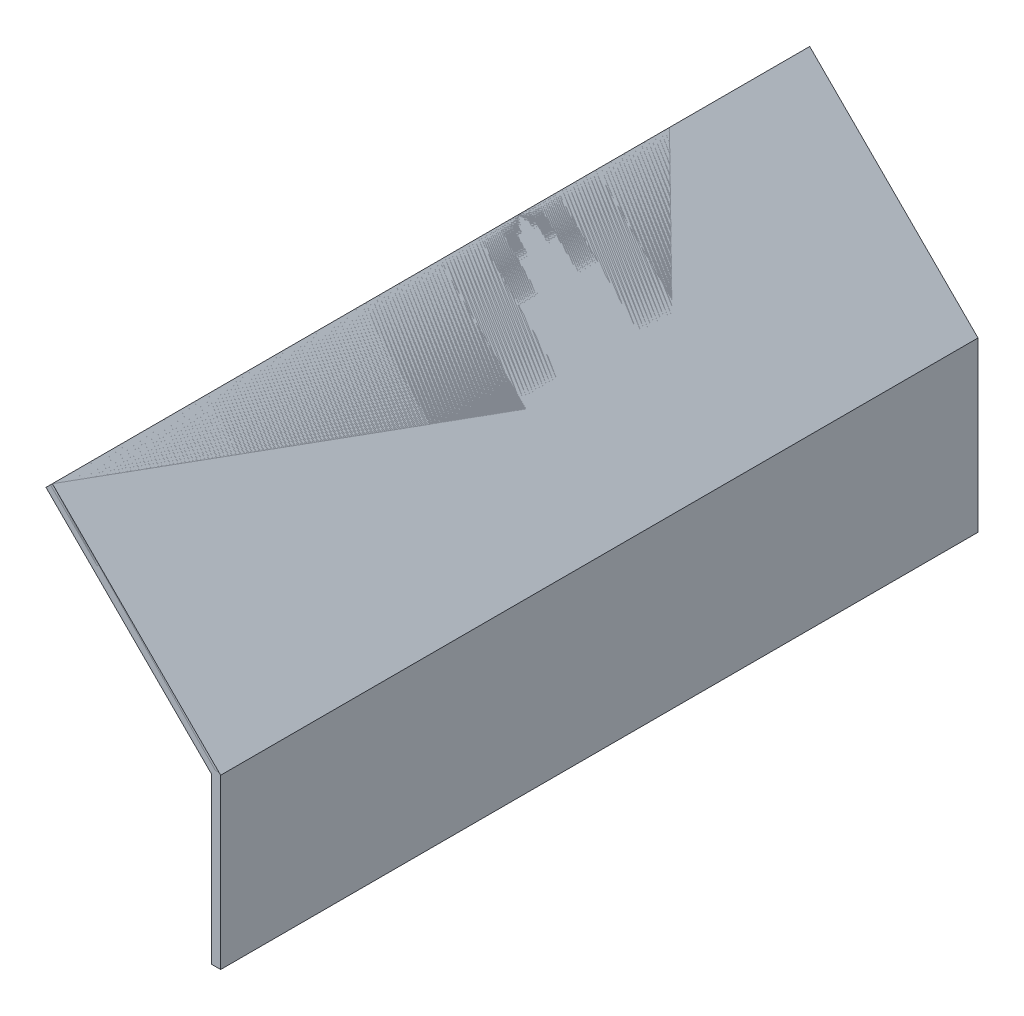
ISO-10303-21;
HEADER;
FILE_DESCRIPTION(('STEP AP214'),'2;1');
FILE_NAME('part.step','',(''),(''),'','','');
FILE_SCHEMA(('AUTOMOTIVE_DESIGN { 1 0 10303 214 1 1 1 1 }'));
ENDSEC;
DATA;
#1=APPLICATION_CONTEXT('core data for automotive mechanical design processes');
#2=APPLICATION_PROTOCOL_DEFINITION('international standard','automotive_design',2000,#1);
#3=PRODUCT_CONTEXT('',#1,'mechanical');
#4=PRODUCT('Part','Part','',(#3));
#5=PRODUCT_RELATED_PRODUCT_CATEGORY('part','',(#4));
#6=PRODUCT_DEFINITION_FORMATION('','',#4);
#7=PRODUCT_DEFINITION_CONTEXT('part definition',#1,'design');
#8=PRODUCT_DEFINITION('design','',#6,#7);
#9=PRODUCT_DEFINITION_SHAPE('','',#8);
#10=(LENGTH_UNIT() NAMED_UNIT(*) SI_UNIT(.MILLI.,.METRE.));
#11=(NAMED_UNIT(*) PLANE_ANGLE_UNIT() SI_UNIT($,.RADIAN.));
#12=(NAMED_UNIT(*) SI_UNIT($,.STERADIAN.) SOLID_ANGLE_UNIT());
#13=UNCERTAINTY_MEASURE_WITH_UNIT(LENGTH_MEASURE(1.E-05),#10,'distance_accuracy_value','');
#14=(GEOMETRIC_REPRESENTATION_CONTEXT(3) GLOBAL_UNCERTAINTY_ASSIGNED_CONTEXT((#13)) GLOBAL_UNIT_ASSIGNED_CONTEXT((#10,
#11,#12)) REPRESENTATION_CONTEXT('',''));
#15=CARTESIAN_POINT('',(0.,0.,0.));
#16=DIRECTION('',(0.,0.,1.));
#17=DIRECTION('',(1.,0.,0.));
#18=AXIS2_PLACEMENT_3D('',#15,#16,#17);
#19=CARTESIAN_POINT('',(4.064,76.2,0.));
#20=DIRECTION('',(0.,0.,-1.));
#21=DIRECTION('',(-0.707106781186549,0.707106781186546,0.));
#22=AXIS2_PLACEMENT_3D('',#19,#20,#21);
#23=PLANE('',#22);
#24=DIRECTION('',(-0.707106781186549,0.707106781186546,0.));
#25=VECTOR('',#24,1.);
#26=CARTESIAN_POINT('',(3.20548751482579,75.3414875148258,0.));
#27=LINE('',#26,#25);
#28=CARTESIAN_POINT('',(1.61939312693271,76.9275819027189,0.));
#29=VERTEX_POINT('',#28);
#30=CARTESIAN_POINT('',(-72.9945124851745,151.541487514826,0.));
#31=VERTEX_POINT('',#30);
#32=EDGE_CURVE('E201',#29,#31,#27,.T.);
#33=ORIENTED_EDGE('',*,*,#32,.F.);
#34=DIRECTION('',(1.,0.,0.));
#35=VECTOR('',#34,1.);
#36=CARTESIAN_POINT('',(-139.7,76.9275819027189,0.));
#37=LINE('',#36,#35);
#38=CARTESIAN_POINT('',(3.33641809728114,76.9275819027189,0.));
#39=VERTEX_POINT('',#38);
#40=EDGE_CURVE('E166',#29,#39,#37,.T.);
#41=ORIENTED_EDGE('',*,*,#40,.T.);
#42=DIRECTION('',(-0.707106781186549,0.707106781186546,0.));
#43=VECTOR('',#42,1.);
#44=CARTESIAN_POINT('',(4.064,76.2,0.));
#45=LINE('',#44,#43);
#46=CARTESIAN_POINT('',(-72.1360000000003,152.4,0.));
#47=VERTEX_POINT('',#46);
#48=EDGE_CURVE('E183',#39,#47,#45,.T.);
#49=ORIENTED_EDGE('',*,*,#48,.T.);
#50=DIRECTION('',(0.707106781186546,0.707106781186549,0.));
#51=VECTOR('',#50,1.);
#52=CARTESIAN_POINT('',(-72.1360000000003,152.4,0.));
#53=LINE('',#52,#51);
#54=EDGE_CURVE('E195',#31,#47,#53,.T.);
#55=ORIENTED_EDGE('',*,*,#54,.F.);
#56=EDGE_LOOP('',(#33,#41,#49,#55));
#57=FACE_BOUND('',#56,.T.);
#58=ADVANCED_FACE('F53',(#57),#23,.F.);
#59=CARTESIAN_POINT('',(3.20548751482579,75.3414875148258,-342.9));
#60=DIRECTION('',(0.707106781186546,0.707106781186549,0.));
#61=DIRECTION('',(-0.707106781186549,0.707106781186546,0.));
#62=AXIS2_PLACEMENT_3D('',#59,#60,#61);
#63=PLANE('',#62);
#64=DIRECTION('',(0.,0.,1.));
#65=VECTOR('',#64,1.);
#66=CARTESIAN_POINT('',(-72.9945124851745,151.541487514826,-342.9));
#67=LINE('',#66,#65);
#68=CARTESIAN_POINT('',(-72.9945124851745,151.541487514826,-279.4));
#69=VERTEX_POINT('',#68);
#70=EDGE_CURVE('E146',#69,#31,#67,.T.);
#71=ORIENTED_EDGE('',*,*,#70,.F.);
#72=DIRECTION('',(0.707106781186549,-0.707106781186546,0.));
#73=VECTOR('',#72,1.);
#74=CARTESIAN_POINT('',(3.20548751482579,75.3414875148258,-279.4));
#75=LINE('',#74,#73);
#76=CARTESIAN_POINT('',(1.61939312693271,76.9275819027189,-279.4));
#77=VERTEX_POINT('',#76);
#78=EDGE_CURVE('E134',#69,#77,#75,.T.);
#79=ORIENTED_EDGE('',*,*,#78,.T.);
#80=DIRECTION('',(0.,0.,1.));
#81=VECTOR('',#80,1.);
#82=CARTESIAN_POINT('',(1.6193931269327,76.9275819027189,-342.9));
#83=LINE('',#82,#81);
#84=CARTESIAN_POINT('',(1.61939312693271,76.9275819027189,-206.375));
#85=VERTEX_POINT('',#84);
#86=EDGE_CURVE('E143',#77,#85,#83,.T.);
#87=ORIENTED_EDGE('',*,*,#86,.T.);
#88=DIRECTION('',(0.707106781186549,-0.707106781186546,0.));
#89=VECTOR('',#88,1.);
#90=CARTESIAN_POINT('',(3.20548751482579,75.3414875148258,-206.375));
#91=LINE('',#90,#89);
#92=CARTESIAN_POINT('',(2.47790561210692,76.0690694175447,-206.375));
#93=VERTEX_POINT('',#92);
#94=EDGE_CURVE('E248',#85,#93,#91,.T.);
#95=ORIENTED_EDGE('',*,*,#94,.T.);
#96=DIRECTION('',(0.,0.,1.));
#97=VECTOR('',#96,1.);
#98=CARTESIAN_POINT('',(2.47790561210692,76.0690694175447,-342.9));
#99=LINE('',#98,#97);
#100=CARTESIAN_POINT('',(2.47790561210692,76.0690694175447,-73.025));
#101=VERTEX_POINT('',#100);
#102=EDGE_CURVE('E184',#101,#93,#99,.F.);
#103=ORIENTED_EDGE('',*,*,#102,.F.);
#104=DIRECTION('',(-0.707106781186549,0.707106781186546,0.));
#105=VECTOR('',#104,1.);
#106=CARTESIAN_POINT('',(3.20548751482579,75.3414875148258,-73.025));
#107=LINE('',#106,#105);
#108=CARTESIAN_POINT('',(1.61939312693271,76.9275819027189,-73.025));
#109=VERTEX_POINT('',#108);
#110=EDGE_CURVE('E172',#101,#109,#107,.T.);
#111=ORIENTED_EDGE('',*,*,#110,.T.);
#112=DIRECTION('',(0.,0.,-1.));
#113=VECTOR('',#112,1.);
#114=CARTESIAN_POINT('',(1.6193931269327,76.9275819027189,-342.9));
#115=LINE('',#114,#113);
#116=EDGE_CURVE('E210',#29,#109,#115,.T.);
#117=ORIENTED_EDGE('',*,*,#116,.F.);
#118=ORIENTED_EDGE('',*,*,#32,.T.);
#119=EDGE_LOOP('',(#71,#79,#87,#95,#103,#111,#117,#118));
#120=FACE_BOUND('',#119,.T.);
#121=ADVANCED_FACE('F141',(#120),#63,.F.);
#122=CARTESIAN_POINT('',(4.06400000000001,0.,-342.9));
#123=DIRECTION('',(0.,1.,0.));
#124=DIRECTION('',(0.,0.,1.));
#125=AXIS2_PLACEMENT_3D('',#122,#123,#124);
#126=PLANE('',#125);
#127=DIRECTION('',(1.,0.,0.));
#128=VECTOR('',#127,1.);
#129=CARTESIAN_POINT('',(-139.7,0.,-206.375));
#130=LINE('',#129,#128);
#131=CARTESIAN_POINT('',(2.84988,0.,-206.375));
#132=VERTEX_POINT('',#131);
#133=CARTESIAN_POINT('',(4.06400000000001,0.,-206.375));
#134=VERTEX_POINT('',#133);
#135=EDGE_CURVE('E227',#132,#134,#130,.T.);
#136=ORIENTED_EDGE('',*,*,#135,.T.);
#137=DIRECTION('',(0.,0.,1.));
#138=VECTOR('',#137,1.);
#139=CARTESIAN_POINT('',(4.06400000000001,0.,-342.9));
#140=LINE('',#139,#138);
#141=CARTESIAN_POINT('',(4.06400000000001,0.,-73.025));
#142=VERTEX_POINT('',#141);
#143=EDGE_CURVE('E181',#134,#142,#140,.T.);
#144=ORIENTED_EDGE('',*,*,#143,.T.);
#145=DIRECTION('',(1.,0.,0.));
#146=VECTOR('',#145,1.);
#147=CARTESIAN_POINT('',(-139.7,0.,-73.025));
#148=LINE('',#147,#146);
#149=CARTESIAN_POINT('',(2.84988,0.,-73.025));
#150=VERTEX_POINT('',#149);
#151=EDGE_CURVE('E154',#150,#142,#148,.T.);
#152=ORIENTED_EDGE('',*,*,#151,.F.);
#153=DIRECTION('',(0.,0.,1.));
#154=VECTOR('',#153,1.);
#155=CARTESIAN_POINT('',(2.84988000000001,0.,-342.9));
#156=LINE('',#155,#154);
#157=EDGE_CURVE('E180',#132,#150,#156,.T.);
#158=ORIENTED_EDGE('',*,*,#157,.F.);
#159=EDGE_LOOP('',(#136,#144,#152,#158));
#160=FACE_BOUND('',#159,.T.);
#161=ADVANCED_FACE('F55',(#160),#126,.F.);
#162=CARTESIAN_POINT('',(-72.1360000000003,152.4,-342.9));
#163=DIRECTION('',(-0.707106781186549,0.707106781186546,0.));
#164=DIRECTION('',(0.,0.,1.));
#165=AXIS2_PLACEMENT_3D('',#162,#163,#164);
#166=PLANE('',#165);
#167=DIRECTION('',(0.707106781186546,0.707106781186549,0.));
#168=VECTOR('',#167,1.);
#169=CARTESIAN_POINT('',(-72.1360000000003,152.4,-279.4));
#170=LINE('',#169,#168);
#171=CARTESIAN_POINT('',(-72.1360000000003,152.4,-279.4));
#172=VERTEX_POINT('',#171);
#173=EDGE_CURVE('E148',#69,#172,#170,.T.);
#174=ORIENTED_EDGE('',*,*,#173,.F.);
#175=ORIENTED_EDGE('',*,*,#70,.T.);
#176=ORIENTED_EDGE('',*,*,#54,.T.);
#177=DIRECTION('',(0.,0.,1.));
#178=VECTOR('',#177,1.);
#179=CARTESIAN_POINT('',(-72.1360000000003,152.4,-342.9));
#180=LINE('',#179,#178);
#181=EDGE_CURVE('E187',#172,#47,#180,.T.);
#182=ORIENTED_EDGE('',*,*,#181,.F.);
#183=EDGE_LOOP('',(#174,#175,#176,#182));
#184=FACE_BOUND('',#183,.T.);
#185=ADVANCED_FACE('F268',(#184),#166,.T.);
#186=CARTESIAN_POINT('',(4.064,76.2,-342.9));
#187=DIRECTION('',(0.707106781186546,0.707106781186549,0.));
#188=DIRECTION('',(-0.707106781186549,0.707106781186546,0.));
#189=AXIS2_PLACEMENT_3D('',#186,#187,#188);
#190=PLANE('',#189);
#191=DIRECTION('',(0.707106781186549,-0.707106781186546,0.));
#192=VECTOR('',#191,1.);
#193=CARTESIAN_POINT('',(4.064,76.2,-279.4));
#194=LINE('',#193,#192);
#195=CARTESIAN_POINT('',(3.33641809728113,76.9275819027189,-279.4));
#196=VERTEX_POINT('',#195);
#197=EDGE_CURVE('E68',#172,#196,#194,.T.);
#198=ORIENTED_EDGE('',*,*,#197,.F.);
#199=ORIENTED_EDGE('',*,*,#181,.T.);
#200=ORIENTED_EDGE('',*,*,#48,.F.);
#201=DIRECTION('',(0.,0.,1.));
#202=VECTOR('',#201,1.);
#203=CARTESIAN_POINT('',(3.33641809728113,76.9275819027189,-342.9));
#204=LINE('',#203,#202);
#205=CARTESIAN_POINT('',(3.33641809728113,76.9275819027189,-73.025));
#206=VERTEX_POINT('',#205);
#207=EDGE_CURVE('E192',#39,#206,#204,.F.);
#208=ORIENTED_EDGE('',*,*,#207,.T.);
#209=CARTESIAN_POINT('',(3.33641809728114,76.9275819027189,-206.375));
#210=VERTEX_POINT('',#209);
#211=EDGE_CURVE('E196',#206,#210,#204,.F.);
#212=ORIENTED_EDGE('',*,*,#211,.T.);
#213=EDGE_CURVE('E191',#210,#196,#204,.F.);
#214=ORIENTED_EDGE('',*,*,#213,.T.);
#215=EDGE_LOOP('',(#198,#199,#200,#208,#212,#214));
#216=FACE_BOUND('',#215,.T.);
#217=ADVANCED_FACE('F241',(#216),#190,.T.);
#218=CARTESIAN_POINT('',(4.06400000000001,0.,-342.9));
#219=DIRECTION('',(1.,0.,0.));
#220=DIRECTION('',(0.,1.,0.));
#221=AXIS2_PLACEMENT_3D('',#218,#219,#220);
#222=PLANE('',#221);
#223=CARTESIAN_POINT('',(4.06400000000001,12.7,-193.675));
#224=DIRECTION('',(1.,0.,0.));
#225=DIRECTION('',(0.,1.,0.));
#226=AXIS2_PLACEMENT_3D('',#223,#224,#225);
#227=CIRCLE('',#226,3.26389999999998);
#228=CARTESIAN_POINT('',(4.06400000000001,15.9639,-193.675));
#229=VERTEX_POINT('',#228);
#230=EDGE_CURVE('E253',#229,#229,#227,.T.);
#231=ORIENTED_EDGE('',*,*,#230,.F.);
#232=EDGE_LOOP('',(#231));
#233=FACE_BOUND('',#232,.T.);
#234=CARTESIAN_POINT('',(4.06400000000001,12.7,-85.725));
#235=DIRECTION('',(1.,0.,0.));
#236=DIRECTION('',(0.,1.,0.));
#237=AXIS2_PLACEMENT_3D('',#234,#235,#236);
#238=CIRCLE('',#237,3.26389999999999);
#239=CARTESIAN_POINT('',(4.06400000000001,15.9639,-85.725));
#240=VERTEX_POINT('',#239);
#241=EDGE_CURVE('E257',#240,#240,#238,.T.);
#242=ORIENTED_EDGE('',*,*,#241,.F.);
#243=EDGE_LOOP('',(#242));
#244=FACE_BOUND('',#243,.T.);
#245=DIRECTION('',(0.,-1.,0.));
#246=VECTOR('',#245,1.);
#247=CARTESIAN_POINT('',(4.06400000000001,0.,-206.375));
#248=LINE('',#247,#246);
#249=CARTESIAN_POINT('',(4.064,75.1710438054377,-206.375));
#250=VERTEX_POINT('',#249);
#251=EDGE_CURVE('E155',#250,#134,#248,.T.);
#252=ORIENTED_EDGE('',*,*,#251,.F.);
#253=DIRECTION('',(0.,0.,1.));
#254=VECTOR('',#253,1.);
#255=CARTESIAN_POINT('',(4.064,75.1710438054377,-342.9));
#256=LINE('',#255,#254);
#257=CARTESIAN_POINT('',(4.064,75.1710438054377,-73.025));
#258=VERTEX_POINT('',#257);
#259=EDGE_CURVE('E189',#250,#258,#256,.T.);
#260=ORIENTED_EDGE('',*,*,#259,.T.);
#261=DIRECTION('',(0.,1.,0.));
#262=VECTOR('',#261,1.);
#263=CARTESIAN_POINT('',(4.06400000000001,0.,-73.025));
#264=LINE('',#263,#262);
#265=EDGE_CURVE('E177',#142,#258,#264,.T.);
#266=ORIENTED_EDGE('',*,*,#265,.F.);
#267=ORIENTED_EDGE('',*,*,#143,.F.);
#268=EDGE_LOOP('',(#252,#260,#266,#267));
#269=FACE_BOUND('',#268,.T.);
#270=ADVANCED_FACE('F230',(#233,#244,#269),#222,.T.);
#271=CARTESIAN_POINT('',(1.57988,75.1710438054377,-342.9));
#272=DIRECTION('',(0.,0.,1.));
#273=DIRECTION('',(1.,0.,0.));
#274=AXIS2_PLACEMENT_3D('',#271,#272,#273);
#275=CYLINDRICAL_SURFACE('',#274,2.48412);
#276=CARTESIAN_POINT('',(1.57988,75.1710438054377,-206.375));
#277=DIRECTION('',(0.,0.,1.));
#278=DIRECTION('',(1.,0.,0.));
#279=AXIS2_PLACEMENT_3D('',#276,#277,#278);
#280=CIRCLE('',#279,2.48412);
#281=EDGE_CURVE('E160',#210,#250,#280,.F.);
#282=ORIENTED_EDGE('',*,*,#281,.F.);
#283=ORIENTED_EDGE('',*,*,#211,.F.);
#284=CARTESIAN_POINT('',(1.57988,75.1710438054377,-73.025));
#285=DIRECTION('',(0.,0.,-1.));
#286=DIRECTION('',(-1.,0.,0.));
#287=AXIS2_PLACEMENT_3D('',#284,#285,#286);
#288=CIRCLE('',#287,2.48412);
#289=EDGE_CURVE('E175',#258,#206,#288,.F.);
#290=ORIENTED_EDGE('',*,*,#289,.F.);
#291=ORIENTED_EDGE('',*,*,#259,.F.);
#292=EDGE_LOOP('',(#282,#283,#290,#291));
#293=FACE_BOUND('',#292,.T.);
#294=ADVANCED_FACE('F237',(#293),#275,.T.);
#295=CARTESIAN_POINT('',(2.84988000000001,0.,-342.9));
#296=DIRECTION('',(1.,0.,0.));
#297=DIRECTION('',(0.,1.,0.));
#298=AXIS2_PLACEMENT_3D('',#295,#296,#297);
#299=PLANE('',#298);
#300=CARTESIAN_POINT('',(2.84988000000001,12.7,-193.675));
#301=DIRECTION('',(-1.,0.,0.));
#302=DIRECTION('',(0.,-1.,0.));
#303=AXIS2_PLACEMENT_3D('',#300,#301,#302);
#304=CIRCLE('',#303,3.26389999999998);
#305=CARTESIAN_POINT('',(2.84988000000001,9.43610000000001,-193.675));
#306=VERTEX_POINT('',#305);
#307=EDGE_CURVE('E260',#306,#306,#304,.T.);
#308=ORIENTED_EDGE('',*,*,#307,.F.);
#309=EDGE_LOOP('',(#308));
#310=FACE_BOUND('',#309,.T.);
#311=CARTESIAN_POINT('',(2.84988000000001,12.7,-85.725));
#312=DIRECTION('',(-1.,0.,0.));
#313=DIRECTION('',(0.,-1.,0.));
#314=AXIS2_PLACEMENT_3D('',#311,#312,#313);
#315=CIRCLE('',#314,3.26389999999999);
#316=CARTESIAN_POINT('',(2.84988000000001,9.4361,-85.725));
#317=VERTEX_POINT('',#316);
#318=EDGE_CURVE('E147',#317,#317,#315,.T.);
#319=ORIENTED_EDGE('',*,*,#318,.F.);
#320=EDGE_LOOP('',(#319));
#321=FACE_BOUND('',#320,.T.);
#322=DIRECTION('',(0.,0.,1.));
#323=VECTOR('',#322,1.);
#324=CARTESIAN_POINT('',(2.84988,75.1710438054377,-342.9));
#325=LINE('',#324,#323);
#326=CARTESIAN_POINT('',(2.84988,75.1710438054377,-206.375));
#327=VERTEX_POINT('',#326);
#328=CARTESIAN_POINT('',(2.84988,75.1710438054377,-73.025));
#329=VERTEX_POINT('',#328);
#330=EDGE_CURVE('E199',#327,#329,#325,.T.);
#331=ORIENTED_EDGE('',*,*,#330,.F.);
#332=DIRECTION('',(0.,-1.,0.));
#333=VECTOR('',#332,1.);
#334=CARTESIAN_POINT('',(2.84988000000001,0.,-206.375));
#335=LINE('',#334,#333);
#336=EDGE_CURVE('E75',#327,#132,#335,.T.);
#337=ORIENTED_EDGE('',*,*,#336,.T.);
#338=ORIENTED_EDGE('',*,*,#157,.T.);
#339=DIRECTION('',(0.,1.,0.));
#340=VECTOR('',#339,1.);
#341=CARTESIAN_POINT('',(2.84988000000001,0.,-73.025));
#342=LINE('',#341,#340);
#343=EDGE_CURVE('E169',#150,#329,#342,.T.);
#344=ORIENTED_EDGE('',*,*,#343,.T.);
#345=EDGE_LOOP('',(#331,#337,#338,#344));
#346=FACE_BOUND('',#345,.T.);
#347=ADVANCED_FACE('F217',(#310,#321,#346),#299,.F.);
#348=CARTESIAN_POINT('',(1.57988,75.1710438054377,-342.9));
#349=DIRECTION('',(0.,0.,1.));
#350=DIRECTION('',(1.,0.,0.));
#351=AXIS2_PLACEMENT_3D('',#348,#349,#350);
#352=CYLINDRICAL_SURFACE('',#351,1.27);
#353=ORIENTED_EDGE('',*,*,#102,.T.);
#354=CARTESIAN_POINT('',(1.57988,75.1710438054377,-206.375));
#355=DIRECTION('',(0.,0.,1.));
#356=DIRECTION('',(1.,0.,0.));
#357=AXIS2_PLACEMENT_3D('',#354,#355,#356);
#358=CIRCLE('',#357,1.27);
#359=EDGE_CURVE('E61',#93,#327,#358,.F.);
#360=ORIENTED_EDGE('',*,*,#359,.T.);
#361=ORIENTED_EDGE('',*,*,#330,.T.);
#362=CARTESIAN_POINT('',(1.57988,75.1710438054377,-73.025));
#363=DIRECTION('',(0.,0.,-1.));
#364=DIRECTION('',(-1.,0.,0.));
#365=AXIS2_PLACEMENT_3D('',#362,#363,#364);
#366=CIRCLE('',#365,1.27);
#367=EDGE_CURVE('E207',#329,#101,#366,.F.);
#368=ORIENTED_EDGE('',*,*,#367,.T.);
#369=EDGE_LOOP('',(#353,#360,#361,#368));
#370=FACE_BOUND('',#369,.T.);
#371=ADVANCED_FACE('F213',(#370),#352,.F.);
#372=CARTESIAN_POINT('',(-139.7,76.9275819027189,0.));
#373=DIRECTION('',(0.,-1.,0.));
#374=DIRECTION('',(0.,0.,-1.));
#375=AXIS2_PLACEMENT_3D('',#372,#373,#374);
#376=PLANE('',#375);
#377=ORIENTED_EDGE('',*,*,#40,.F.);
#378=ORIENTED_EDGE('',*,*,#116,.T.);
#379=DIRECTION('',(1.,0.,0.));
#380=VECTOR('',#379,1.);
#381=CARTESIAN_POINT('',(-139.7,76.9275819027189,-73.025));
#382=LINE('',#381,#380);
#383=EDGE_CURVE('E158',#109,#206,#382,.T.);
#384=ORIENTED_EDGE('',*,*,#383,.T.);
#385=ORIENTED_EDGE('',*,*,#207,.F.);
#386=EDGE_LOOP('',(#377,#378,#384,#385));
#387=FACE_BOUND('',#386,.T.);
#388=ADVANCED_FACE('F243',(#387),#376,.T.);
#389=CARTESIAN_POINT('',(-139.7,0.,-73.025));
#390=DIRECTION('',(0.,0.,-1.));
#391=DIRECTION('',(-1.,0.,0.));
#392=AXIS2_PLACEMENT_3D('',#389,#390,#391);
#393=PLANE('',#392);
#394=ORIENTED_EDGE('',*,*,#265,.T.);
#395=ORIENTED_EDGE('',*,*,#289,.T.);
#396=ORIENTED_EDGE('',*,*,#383,.F.);
#397=ORIENTED_EDGE('',*,*,#110,.F.);
#398=ORIENTED_EDGE('',*,*,#367,.F.);
#399=ORIENTED_EDGE('',*,*,#343,.F.);
#400=ORIENTED_EDGE('',*,*,#151,.T.);
#401=EDGE_LOOP('',(#394,#395,#396,#397,#398,#399,#400));
#402=FACE_BOUND('',#401,.T.);
#403=ADVANCED_FACE('F222',(#402),#393,.F.);
#404=CARTESIAN_POINT('',(-139.7,76.9275819027189,-292.1));
#405=DIRECTION('',(0.,1.,0.));
#406=DIRECTION('',(0.,0.,1.));
#407=AXIS2_PLACEMENT_3D('',#404,#405,#406);
#408=PLANE('',#407);
#409=ORIENTED_EDGE('',*,*,#86,.F.);
#410=DIRECTION('',(1.,0.,0.));
#411=VECTOR('',#410,1.);
#412=CARTESIAN_POINT('',(-139.7,76.9275819027189,-279.4));
#413=LINE('',#412,#411);
#414=EDGE_CURVE('E12',#77,#196,#413,.T.);
#415=ORIENTED_EDGE('',*,*,#414,.T.);
#416=ORIENTED_EDGE('',*,*,#213,.F.);
#417=DIRECTION('',(1.,0.,0.));
#418=VECTOR('',#417,1.);
#419=CARTESIAN_POINT('',(-139.7,76.9275819027189,-206.375));
#420=LINE('',#419,#418);
#421=EDGE_CURVE('E153',#85,#210,#420,.T.);
#422=ORIENTED_EDGE('',*,*,#421,.F.);
#423=EDGE_LOOP('',(#409,#415,#416,#422));
#424=FACE_BOUND('',#423,.T.);
#425=ADVANCED_FACE('F151',(#424),#408,.F.);
#426=CARTESIAN_POINT('',(-139.7,0.,-206.375));
#427=DIRECTION('',(0.,0.,1.));
#428=DIRECTION('',(1.,0.,0.));
#429=AXIS2_PLACEMENT_3D('',#426,#427,#428);
#430=PLANE('',#429);
#431=ORIENTED_EDGE('',*,*,#251,.T.);
#432=ORIENTED_EDGE('',*,*,#135,.F.);
#433=ORIENTED_EDGE('',*,*,#336,.F.);
#434=ORIENTED_EDGE('',*,*,#359,.F.);
#435=ORIENTED_EDGE('',*,*,#94,.F.);
#436=ORIENTED_EDGE('',*,*,#421,.T.);
#437=ORIENTED_EDGE('',*,*,#281,.T.);
#438=EDGE_LOOP('',(#431,#432,#433,#434,#435,#436,#437));
#439=FACE_BOUND('',#438,.T.);
#440=ADVANCED_FACE('F298',(#439),#430,.F.);
#441=CARTESIAN_POINT('',(294.94988,12.7,-85.725));
#442=DIRECTION('',(-1.,0.,0.));
#443=DIRECTION('',(0.,-1.,0.));
#444=AXIS2_PLACEMENT_3D('',#441,#442,#443);
#445=CYLINDRICAL_SURFACE('',#444,3.26389999999999);
#446=ORIENTED_EDGE('',*,*,#241,.T.);
#447=EDGE_LOOP('',(#446));
#448=FACE_BOUND('',#447,.T.);
#449=ORIENTED_EDGE('',*,*,#318,.T.);
#450=EDGE_LOOP('',(#449));
#451=FACE_BOUND('',#450,.T.);
#452=ADVANCED_FACE('F301',(#448,#451),#445,.F.);
#453=CARTESIAN_POINT('',(294.94988,12.7,-193.675));
#454=DIRECTION('',(-1.,0.,0.));
#455=DIRECTION('',(0.,-1.,0.));
#456=AXIS2_PLACEMENT_3D('',#453,#454,#455);
#457=CYLINDRICAL_SURFACE('',#456,3.26389999999998);
#458=ORIENTED_EDGE('',*,*,#230,.T.);
#459=EDGE_LOOP('',(#458));
#460=FACE_BOUND('',#459,.T.);
#461=ORIENTED_EDGE('',*,*,#307,.T.);
#462=EDGE_LOOP('',(#461));
#463=FACE_BOUND('',#462,.T.);
#464=ADVANCED_FACE('F304',(#460,#463),#457,.F.);
#465=CARTESIAN_POINT('',(-75.0096819587424,76.9275819027189,-279.4));
#466=DIRECTION('',(0.,0.,1.));
#467=DIRECTION('',(1.,0.,0.));
#468=AXIS2_PLACEMENT_3D('',#465,#466,#467);
#469=PLANE('',#468);
#470=ORIENTED_EDGE('',*,*,#173,.T.);
#471=ORIENTED_EDGE('',*,*,#197,.T.);
#472=ORIENTED_EDGE('',*,*,#414,.F.);
#473=ORIENTED_EDGE('',*,*,#78,.F.);
#474=EDGE_LOOP('',(#470,#471,#472,#473));
#475=FACE_BOUND('',#474,.T.);
#476=ADVANCED_FACE('F133',(#475),#469,.F.);
#477=CLOSED_SHELL('',(#58,#121,#161,#185,#217,#270,#294,#347,#371,#388,#403,#425,#440,#452,#464,#476));
#478=MANIFOLD_SOLID_BREP('B2',#477);
#479=CARTESIAN_POINT('',(0.,74.5166360825157,-342.9));
#480=DIRECTION('',(-1.,0.,0.));
#481=DIRECTION('',(0.,0.,1.));
#482=AXIS2_PLACEMENT_3D('',#479,#480,#481);
#483=PLANE('',#482);
#484=DIRECTION('',(0.,-1.,0.));
#485=VECTOR('',#484,1.);
#486=CARTESIAN_POINT('',(0.,74.5166360825157,0.));
#487=LINE('',#486,#485);
#488=CARTESIAN_POINT('',(0.,74.5166360825157,0.));
#489=VERTEX_POINT('',#488);
#490=CARTESIAN_POINT('',(0.,0.,0.));
#491=VERTEX_POINT('',#490);
#492=EDGE_CURVE('E532',#489,#491,#487,.T.);
#493=ORIENTED_EDGE('',*,*,#492,.F.);
#494=DIRECTION('',(0.,0.,1.));
#495=VECTOR('',#494,1.);
#496=CARTESIAN_POINT('',(0.,74.5166360825157,-342.9));
#497=LINE('',#496,#495);
#498=CARTESIAN_POINT('',(0.,74.5166360825157,-342.9));
#499=VERTEX_POINT('',#498);
#500=EDGE_CURVE('E51',#499,#489,#497,.T.);
#501=ORIENTED_EDGE('',*,*,#500,.F.);
#502=DIRECTION('',(0.,-1.,0.));
#503=VECTOR('',#502,1.);
#504=CARTESIAN_POINT('',(0.,74.5166360825157,-342.9));
#505=LINE('',#504,#503);
#506=CARTESIAN_POINT('',(0.,0.,-342.9));
#507=VERTEX_POINT('',#506);
#508=EDGE_CURVE('E545',#499,#507,#505,.T.);
#509=ORIENTED_EDGE('',*,*,#508,.T.);
#510=DIRECTION('',(0.,0.,1.));
#511=VECTOR('',#510,1.);
#512=CARTESIAN_POINT('',(0.,0.,-342.9));
#513=LINE('',#512,#511);
#514=EDGE_CURVE('E446',#507,#491,#513,.T.);
#515=ORIENTED_EDGE('',*,*,#514,.T.);
#516=EDGE_LOOP('',(#493,#501,#509,#515));
#517=FACE_BOUND('',#516,.T.);
#518=ADVANCED_FACE('F443',(#517),#483,.T.);
#519=CARTESIAN_POINT('',(0.,74.5166360825157,-342.9));
#520=DIRECTION('',(-0.707106781186547,-0.707106781186548,0.));
#521=DIRECTION('',(0.707106781186548,-0.707106781186547,0.));
#522=AXIS2_PLACEMENT_3D('',#519,#520,#521);
#523=PLANE('',#522);
#524=DIRECTION('',(0.707106781186547,-0.707106781186547,0.));
#525=VECTOR('',#524,1.);
#526=CARTESIAN_POINT('',(0.,74.5166360825157,0.));
#527=LINE('',#526,#525);
#528=CARTESIAN_POINT('',(-75.0096819587424,149.526318041258,0.));
#529=VERTEX_POINT('',#528);
#530=EDGE_CURVE('E480',#529,#489,#527,.T.);
#531=ORIENTED_EDGE('',*,*,#530,.F.);
#532=DIRECTION('',(0.,0.,1.));
#533=VECTOR('',#532,1.);
#534=CARTESIAN_POINT('',(-75.0096819587424,149.526318041258,-342.9));
#535=LINE('',#534,#533);
#536=CARTESIAN_POINT('',(-75.0096819587424,149.526318041258,-342.9));
#537=VERTEX_POINT('',#536);
#538=EDGE_CURVE('E452',#537,#529,#535,.T.);
#539=ORIENTED_EDGE('',*,*,#538,.F.);
#540=DIRECTION('',(0.707106781186838,-0.707106781186257,0.));
#541=VECTOR('',#540,1.);
#542=CARTESIAN_POINT('',(-75.0096819587424,149.526318041258,-342.9));
#543=LINE('',#542,#541);
#544=EDGE_CURVE('E460',#537,#499,#543,.T.);
#545=ORIENTED_EDGE('',*,*,#544,.T.);
#546=ORIENTED_EDGE('',*,*,#500,.T.);
#547=EDGE_LOOP('',(#531,#539,#545,#546));
#548=FACE_BOUND('',#547,.T.);
#549=ADVANCED_FACE('F567',(#548),#523,.T.);
#550=CARTESIAN_POINT('',(-72.1360000000003,152.4,-342.9));
#551=DIRECTION('',(-0.707106781186551,0.707106781186544,0.));
#552=DIRECTION('',(-0.707106781186544,-0.707106781186551,0.));
#553=AXIS2_PLACEMENT_3D('',#550,#551,#552);
#554=PLANE('',#553);
#555=DIRECTION('',(-0.707106781186544,-0.707106781186551,0.));
#556=VECTOR('',#555,1.);
#557=CARTESIAN_POINT('',(-72.1360000000003,152.4,0.));
#558=LINE('',#557,#556);
#559=CARTESIAN_POINT('',(-72.1360000000003,152.4,0.));
#560=VERTEX_POINT('',#559);
#561=EDGE_CURVE('E505',#560,#529,#558,.T.);
#562=ORIENTED_EDGE('',*,*,#561,.F.);
#563=DIRECTION('',(0.,0.,1.));
#564=VECTOR('',#563,1.);
#565=CARTESIAN_POINT('',(-72.1360000000003,152.4,-342.9));
#566=LINE('',#565,#564);
#567=CARTESIAN_POINT('',(-72.1360000000003,152.4,-342.9));
#568=VERTEX_POINT('',#567);
#569=EDGE_CURVE('E500',#568,#560,#566,.T.);
#570=ORIENTED_EDGE('',*,*,#569,.F.);
#571=DIRECTION('',(-0.707106781186544,-0.707106781186551,0.));
#572=VECTOR('',#571,1.);
#573=CARTESIAN_POINT('',(-72.1360000000003,152.4,-342.9));
#574=LINE('',#573,#572);
#575=EDGE_CURVE('E503',#568,#537,#574,.T.);
#576=ORIENTED_EDGE('',*,*,#575,.T.);
#577=ORIENTED_EDGE('',*,*,#538,.T.);
#578=EDGE_LOOP('',(#562,#570,#576,#577));
#579=FACE_BOUND('',#578,.T.);
#580=ADVANCED_FACE('F502',(#579),#554,.T.);
#581=CARTESIAN_POINT('',(4.064,76.2,-342.9));
#582=DIRECTION('',(0.707106781186546,0.707106781186549,0.));
#583=DIRECTION('',(-0.707106781186549,0.707106781186546,0.));
#584=AXIS2_PLACEMENT_3D('',#581,#582,#583);
#585=PLANE('',#584);
#586=DIRECTION('',(-0.707106781186549,0.707106781186546,0.));
#587=VECTOR('',#586,1.);
#588=CARTESIAN_POINT('',(4.064,76.2,0.));
#589=LINE('',#588,#587);
#590=CARTESIAN_POINT('',(4.064,76.2,0.));
#591=VERTEX_POINT('',#590);
#592=EDGE_CURVE('E542',#591,#560,#589,.T.);
#593=ORIENTED_EDGE('',*,*,#592,.F.);
#594=DIRECTION('',(0.,0.,1.));
#595=VECTOR('',#594,1.);
#596=CARTESIAN_POINT('',(4.064,76.2,-342.9));
#597=LINE('',#596,#595);
#598=CARTESIAN_POINT('',(4.064,76.2,-342.9));
#599=VERTEX_POINT('',#598);
#600=EDGE_CURVE('E511',#599,#591,#597,.T.);
#601=ORIENTED_EDGE('',*,*,#600,.F.);
#602=DIRECTION('',(-0.707106781186549,0.707106781186546,0.));
#603=VECTOR('',#602,1.);
#604=CARTESIAN_POINT('',(4.064,76.2,-342.9));
#605=LINE('',#604,#603);
#606=EDGE_CURVE('E518',#599,#568,#605,.T.);
#607=ORIENTED_EDGE('',*,*,#606,.T.);
#608=ORIENTED_EDGE('',*,*,#569,.T.);
#609=EDGE_LOOP('',(#593,#601,#607,#608));
#610=FACE_BOUND('',#609,.T.);
#611=ADVANCED_FACE('F521',(#610),#585,.T.);
#612=CARTESIAN_POINT('',(4.06400000000001,0.,-342.9));
#613=DIRECTION('',(1.,0.,0.));
#614=DIRECTION('',(0.,1.,0.));
#615=AXIS2_PLACEMENT_3D('',#612,#613,#614);
#616=PLANE('',#615);
#617=DIRECTION('',(0.,1.,0.));
#618=VECTOR('',#617,1.);
#619=CARTESIAN_POINT('',(4.06400000000001,0.,0.));
#620=LINE('',#619,#618);
#621=CARTESIAN_POINT('',(4.06400000000001,0.,0.));
#622=VERTEX_POINT('',#621);
#623=EDGE_CURVE('E538',#622,#591,#620,.T.);
#624=ORIENTED_EDGE('',*,*,#623,.F.);
#625=DIRECTION('',(0.,0.,1.));
#626=VECTOR('',#625,1.);
#627=CARTESIAN_POINT('',(4.06400000000001,0.,-342.9));
#628=LINE('',#627,#626);
#629=CARTESIAN_POINT('',(4.06400000000001,0.,-342.9));
#630=VERTEX_POINT('',#629);
#631=EDGE_CURVE('E548',#630,#622,#628,.T.);
#632=ORIENTED_EDGE('',*,*,#631,.F.);
#633=DIRECTION('',(0.,1.,0.));
#634=VECTOR('',#633,1.);
#635=CARTESIAN_POINT('',(4.06400000000001,0.,-342.9));
#636=LINE('',#635,#634);
#637=EDGE_CURVE('E523',#630,#599,#636,.T.);
#638=ORIENTED_EDGE('',*,*,#637,.T.);
#639=ORIENTED_EDGE('',*,*,#600,.T.);
#640=EDGE_LOOP('',(#624,#632,#638,#639));
#641=FACE_BOUND('',#640,.T.);
#642=ADVANCED_FACE('F557',(#641),#616,.T.);
#643=CARTESIAN_POINT('',(0.,0.,-342.9));
#644=DIRECTION('',(0.,-1.,0.));
#645=DIRECTION('',(0.,0.,-1.));
#646=AXIS2_PLACEMENT_3D('',#643,#644,#645);
#647=PLANE('',#646);
#648=DIRECTION('',(1.,0.,0.));
#649=VECTOR('',#648,1.);
#650=CARTESIAN_POINT('',(0.,0.,0.));
#651=LINE('',#650,#649);
#652=EDGE_CURVE('E535',#491,#622,#651,.T.);
#653=ORIENTED_EDGE('',*,*,#652,.F.);
#654=ORIENTED_EDGE('',*,*,#514,.F.);
#655=DIRECTION('',(1.,0.,0.));
#656=VECTOR('',#655,1.);
#657=CARTESIAN_POINT('',(0.,0.,-342.9));
#658=LINE('',#657,#656);
#659=EDGE_CURVE('E527',#507,#630,#658,.T.);
#660=ORIENTED_EDGE('',*,*,#659,.T.);
#661=ORIENTED_EDGE('',*,*,#631,.T.);
#662=EDGE_LOOP('',(#653,#654,#660,#661));
#663=FACE_BOUND('',#662,.T.);
#664=ADVANCED_FACE('F553',(#663),#647,.T.);
#665=CARTESIAN_POINT('',(0.,0.,-342.9));
#666=DIRECTION('',(0.,0.,1.));
#667=DIRECTION('',(1.,0.,0.));
#668=AXIS2_PLACEMENT_3D('',#665,#666,#667);
#669=PLANE('',#668);
#670=ORIENTED_EDGE('',*,*,#508,.F.);
#671=ORIENTED_EDGE('',*,*,#544,.F.);
#672=ORIENTED_EDGE('',*,*,#575,.F.);
#673=ORIENTED_EDGE('',*,*,#606,.F.);
#674=ORIENTED_EDGE('',*,*,#637,.F.);
#675=ORIENTED_EDGE('',*,*,#659,.F.);
#676=EDGE_LOOP('',(#670,#671,#672,#673,#674,#675));
#677=FACE_BOUND('',#676,.T.);
#678=ADVANCED_FACE('F516',(#677),#669,.F.);
#679=CARTESIAN_POINT('',(0.,0.,0.));
#680=DIRECTION('',(0.,0.,1.));
#681=DIRECTION('',(1.,0.,0.));
#682=AXIS2_PLACEMENT_3D('',#679,#680,#681);
#683=PLANE('',#682);
#684=ORIENTED_EDGE('',*,*,#492,.T.);
#685=ORIENTED_EDGE('',*,*,#652,.T.);
#686=ORIENTED_EDGE('',*,*,#623,.T.);
#687=ORIENTED_EDGE('',*,*,#592,.T.);
#688=ORIENTED_EDGE('',*,*,#561,.T.);
#689=ORIENTED_EDGE('',*,*,#530,.T.);
#690=EDGE_LOOP('',(#684,#685,#686,#687,#688,#689));
#691=FACE_BOUND('',#690,.T.);
#692=ADVANCED_FACE('F555',(#691),#683,.T.);
#693=CLOSED_SHELL('',(#518,#549,#580,#611,#642,#664,#678,#692));
#694=MANIFOLD_SOLID_BREP('B6_NOT_SHOWN',#693);
#695=ADVANCED_BREP_SHAPE_REPRESENTATION('',(#18,#478,#694),#14);
#696=SHAPE_DEFINITION_REPRESENTATION(#9,#695);
ENDSEC;
END-ISO-10303-21;
